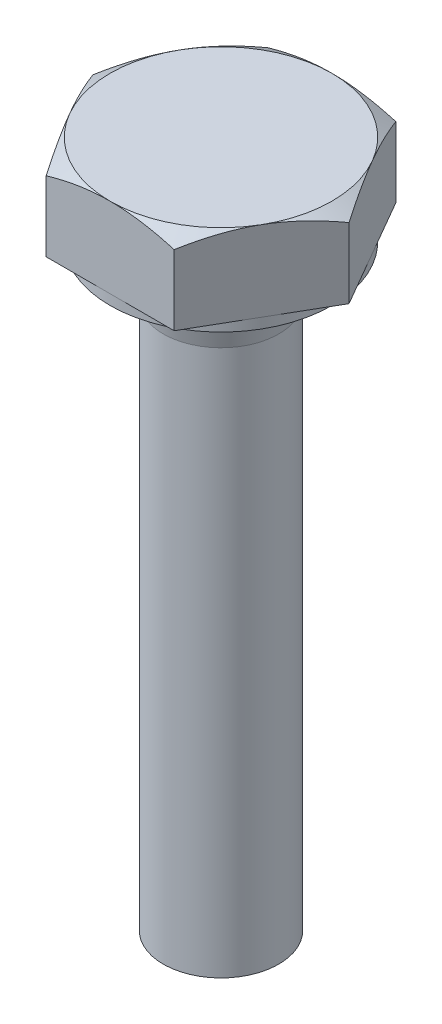
ISO-10303-21;
HEADER;
FILE_DESCRIPTION(('STEP AP214'),'2;1');
FILE_NAME('part.step','',(''),(''),'','','');
FILE_SCHEMA(('AUTOMOTIVE_DESIGN { 1 0 10303 214 1 1 1 1 }'));
ENDSEC;
DATA;
#1=APPLICATION_CONTEXT('core data for automotive mechanical design processes');
#2=APPLICATION_PROTOCOL_DEFINITION('international standard','automotive_design',2000,#1);
#3=PRODUCT_CONTEXT('',#1,'mechanical');
#4=PRODUCT('Part','Part','',(#3));
#5=PRODUCT_RELATED_PRODUCT_CATEGORY('part','',(#4));
#6=PRODUCT_DEFINITION_FORMATION('','',#4);
#7=PRODUCT_DEFINITION_CONTEXT('part definition',#1,'design');
#8=PRODUCT_DEFINITION('design','',#6,#7);
#9=PRODUCT_DEFINITION_SHAPE('','',#8);
#10=(LENGTH_UNIT() NAMED_UNIT(*) SI_UNIT(.MILLI.,.METRE.));
#11=(NAMED_UNIT(*) PLANE_ANGLE_UNIT() SI_UNIT($,.RADIAN.));
#12=(NAMED_UNIT(*) SI_UNIT($,.STERADIAN.) SOLID_ANGLE_UNIT());
#13=UNCERTAINTY_MEASURE_WITH_UNIT(LENGTH_MEASURE(1.E-05),#10,'distance_accuracy_value','');
#14=(GEOMETRIC_REPRESENTATION_CONTEXT(3) GLOBAL_UNCERTAINTY_ASSIGNED_CONTEXT((#13)) GLOBAL_UNIT_ASSIGNED_CONTEXT((#10,
#11,#12)) REPRESENTATION_CONTEXT('',''));
#15=CARTESIAN_POINT('',(0.,0.,0.));
#16=DIRECTION('',(0.,0.,1.));
#17=DIRECTION('',(1.,0.,0.));
#18=AXIS2_PLACEMENT_3D('',#15,#16,#17);
#19=CARTESIAN_POINT('',(7.5055,0.6,0.));
#20=DIRECTION('',(0.,1.,0.));
#21=DIRECTION('',(-1.,0.,0.));
#22=AXIS2_PLACEMENT_3D('',#19,#20,#21);
#23=PLANE('',#22);
#24=DIRECTION('',(-1.,0.,0.));
#25=VECTOR('',#24,1.);
#26=CARTESIAN_POINT('',(7.5055,0.6,-6.5));
#27=LINE('',#26,#25);
#28=CARTESIAN_POINT('',(3.75266974965824,0.599999999999997,-6.5));
#29=VERTEX_POINT('',#28);
#30=CARTESIAN_POINT('',(0.,0.599999999999999,-6.5));
#31=VERTEX_POINT('',#30);
#32=EDGE_CURVE('E315',#29,#31,#27,.T.);
#33=ORIENTED_EDGE('',*,*,#32,.F.);
#34=CARTESIAN_POINT('',(0.,0.599999999999999,0.));
#35=DIRECTION('',(0.,1.,0.));
#36=DIRECTION('',(-1.,0.,0.));
#37=AXIS2_PLACEMENT_3D('',#34,#35,#36);
#38=CIRCLE('',#37,7.5055);
#39=CARTESIAN_POINT('',(3.75283024976971,0.599999999999997,-6.49990733521743));
#40=VERTEX_POINT('',#39);
#41=EDGE_CURVE('E343',#40,#29,#38,.T.);
#42=ORIENTED_EDGE('',*,*,#41,.F.);
#43=DIRECTION('',(-0.499999999999999,0.,-0.866025403784439));
#44=VECTOR('',#43,1.);
#45=CARTESIAN_POINT('',(7.50554012459883,0.6,-2.31659479366357E-05));
#46=LINE('',#45,#44);
#47=CARTESIAN_POINT('',(5.62916512459884,0.6,-3.24999999999998));
#48=VERTEX_POINT('',#47);
#49=EDGE_CURVE('E309',#48,#40,#46,.T.);
#50=ORIENTED_EDGE('',*,*,#49,.F.);
#51=CARTESIAN_POINT('',(0.,0.599999999999999,0.));
#52=DIRECTION('',(0.,1.,0.));
#53=DIRECTION('',(-1.,0.,0.));
#54=AXIS2_PLACEMENT_3D('',#51,#52,#53);
#55=CIRCLE('',#54,6.5);
#56=EDGE_CURVE('E365',#48,#31,#55,.T.);
#57=ORIENTED_EDGE('',*,*,#56,.T.);
#58=EDGE_LOOP('',(#33,#42,#50,#57));
#59=FACE_BOUND('',#58,.T.);
#60=ADVANCED_FACE('F34',(#59),#23,.F.);
#61=CARTESIAN_POINT('',(-3.75266974965824,0.599999999999997,-6.5));
#62=VERTEX_POINT('',#61);
#63=EDGE_CURVE('E314',#31,#62,#27,.T.);
#64=ORIENTED_EDGE('',*,*,#63,.F.);
#65=CARTESIAN_POINT('',(-5.62916512459884,0.599999999999998,-3.24999999999999));
#66=VERTEX_POINT('',#65);
#67=EDGE_CURVE('E363',#31,#66,#55,.T.);
#68=ORIENTED_EDGE('',*,*,#67,.T.);
#69=DIRECTION('',(-0.499999999999999,0.,0.866025403784439));
#70=VECTOR('',#69,1.);
#71=CARTESIAN_POINT('',(-3.75279012459885,0.599999999999999,-6.49997683405203));
#72=LINE('',#71,#70);
#73=CARTESIAN_POINT('',(-3.75283024976972,0.599999999999997,-6.49990733521743));
#74=VERTEX_POINT('',#73);
#75=EDGE_CURVE('E269',#74,#66,#72,.T.);
#76=ORIENTED_EDGE('',*,*,#75,.F.);
#77=EDGE_CURVE('E173',#62,#74,#38,.T.);
#78=ORIENTED_EDGE('',*,*,#77,.F.);
#79=EDGE_LOOP('',(#64,#68,#76,#78));
#80=FACE_BOUND('',#79,.T.);
#81=ADVANCED_FACE('F227',(#80),#23,.F.);
#82=CARTESIAN_POINT('',(7.50549999942797,0.599999999999997,-9.26647825364585E-05));
#83=VERTEX_POINT('',#82);
#84=EDGE_CURVE('E308',#83,#48,#46,.T.);
#85=ORIENTED_EDGE('',*,*,#84,.F.);
#86=CARTESIAN_POINT('',(7.50549999942797,0.599999999999997,9.26647825347238E-05));
#87=VERTEX_POINT('',#86);
#88=EDGE_CURVE('E346',#87,#83,#38,.T.);
#89=ORIENTED_EDGE('',*,*,#88,.F.);
#90=DIRECTION('',(0.499999999999999,0.,-0.866025403784439));
#91=VECTOR('',#90,1.);
#92=CARTESIAN_POINT('',(7.50554012459883,0.6,2.3165947936202E-05));
#93=LINE('',#92,#91);
#94=CARTESIAN_POINT('',(5.62916512459884,0.6,3.24999999999998));
#95=VERTEX_POINT('',#94);
#96=EDGE_CURVE('E422',#95,#87,#93,.T.);
#97=ORIENTED_EDGE('',*,*,#96,.F.);
#98=EDGE_CURVE('E368',#95,#48,#55,.T.);
#99=ORIENTED_EDGE('',*,*,#98,.T.);
#100=EDGE_LOOP('',(#85,#89,#97,#99));
#101=FACE_BOUND('',#100,.T.);
#102=ADVANCED_FACE('F234',(#101),#23,.F.);
#103=CARTESIAN_POINT('',(3.75283024976971,0.599999999999997,6.49990733521743));
#104=VERTEX_POINT('',#103);
#105=EDGE_CURVE('E380',#104,#95,#93,.T.);
#106=ORIENTED_EDGE('',*,*,#105,.F.);
#107=CARTESIAN_POINT('',(3.75266974965824,0.599999999999997,6.5));
#108=VERTEX_POINT('',#107);
#109=EDGE_CURVE('E348',#108,#104,#38,.T.);
#110=ORIENTED_EDGE('',*,*,#109,.F.);
#111=DIRECTION('',(1.,0.,0.));
#112=VECTOR('',#111,1.);
#113=CARTESIAN_POINT('',(7.5055,0.6,6.5));
#114=LINE('',#113,#112);
#115=CARTESIAN_POINT('',(0.,0.599999999999999,6.5));
#116=VERTEX_POINT('',#115);
#117=EDGE_CURVE('E381',#116,#108,#114,.T.);
#118=ORIENTED_EDGE('',*,*,#117,.F.);
#119=EDGE_CURVE('E196',#116,#95,#55,.T.);
#120=ORIENTED_EDGE('',*,*,#119,.T.);
#121=EDGE_LOOP('',(#106,#110,#118,#120));
#122=FACE_BOUND('',#121,.T.);
#123=ADVANCED_FACE('F248',(#122),#23,.F.);
#124=CARTESIAN_POINT('',(-3.75266974965824,0.599999999999997,6.5));
#125=VERTEX_POINT('',#124);
#126=EDGE_CURVE('E386',#125,#116,#114,.T.);
#127=ORIENTED_EDGE('',*,*,#126,.F.);
#128=CARTESIAN_POINT('',(-3.75283024976973,0.599999999999997,6.49990733521742));
#129=VERTEX_POINT('',#128);
#130=EDGE_CURVE('E191',#129,#125,#38,.T.);
#131=ORIENTED_EDGE('',*,*,#130,.F.);
#132=DIRECTION('',(0.499999999999998,0.,0.86602540378444));
#133=VECTOR('',#132,1.);
#134=CARTESIAN_POINT('',(-3.75279012459886,0.599999999999999,6.49997683405203));
#135=LINE('',#134,#133);
#136=CARTESIAN_POINT('',(-5.62916512459885,0.599999999999998,3.24999999999998));
#137=VERTEX_POINT('',#136);
#138=EDGE_CURVE('E260',#137,#129,#135,.T.);
#139=ORIENTED_EDGE('',*,*,#138,.F.);
#140=EDGE_CURVE('E192',#137,#116,#55,.T.);
#141=ORIENTED_EDGE('',*,*,#140,.T.);
#142=EDGE_LOOP('',(#127,#131,#139,#141));
#143=FACE_BOUND('',#142,.T.);
#144=ADVANCED_FACE('F240',(#143),#23,.F.);
#145=CARTESIAN_POINT('',(-7.50549999942797,0.599999999999997,9.26647825403616E-05));
#146=VERTEX_POINT('',#145);
#147=EDGE_CURVE('E253',#146,#137,#135,.T.);
#148=ORIENTED_EDGE('',*,*,#147,.F.);
#149=CARTESIAN_POINT('',(-7.50549999942797,0.599999999999997,-9.26647825420963E-05));
#150=VERTEX_POINT('',#149);
#151=EDGE_CURVE('E188',#150,#146,#38,.T.);
#152=ORIENTED_EDGE('',*,*,#151,.F.);
#153=EDGE_CURVE('E267',#66,#150,#72,.T.);
#154=ORIENTED_EDGE('',*,*,#153,.F.);
#155=EDGE_CURVE('E197',#66,#137,#55,.T.);
#156=ORIENTED_EDGE('',*,*,#155,.T.);
#157=EDGE_LOOP('',(#148,#152,#154,#156));
#158=FACE_BOUND('',#157,.T.);
#159=ADVANCED_FACE('F230',(#158),#23,.F.);
#160=CARTESIAN_POINT('',(0.,5.3,0.));
#161=DIRECTION('',(0.,1.,0.));
#162=DIRECTION('',(-1.,0.,0.));
#163=AXIS2_PLACEMENT_3D('',#160,#161,#162);
#164=CYLINDRICAL_SURFACE('',#163,7.5055);
#165=DIRECTION('',(0.,1.,0.));
#166=VECTOR('',#165,1.);
#167=CARTESIAN_POINT('',(-3.75266974965824,5.3,-6.5));
#168=LINE('',#167,#166);
#169=CARTESIAN_POINT('',(-3.75266974965824,4.71947430432983,-6.5));
#170=VERTEX_POINT('',#169);
#171=EDGE_CURVE('E313',#62,#170,#168,.T.);
#172=ORIENTED_EDGE('',*,*,#171,.F.);
#173=ORIENTED_EDGE('',*,*,#77,.T.);
#174=DIRECTION('',(0.,1.,0.));
#175=VECTOR('',#174,1.);
#176=CARTESIAN_POINT('',(-3.75283024976972,5.3,-6.49990733521743));
#177=LINE('',#176,#175);
#178=CARTESIAN_POINT('',(-3.75283024976972,4.71947430432983,-6.49990733521743));
#179=VERTEX_POINT('',#178);
#180=EDGE_CURVE('E159',#179,#74,#177,.F.);
#181=ORIENTED_EDGE('',*,*,#180,.F.);
#182=CARTESIAN_POINT('',(0.,4.71947430432983,0.));
#183=DIRECTION('',(0.,1.,0.));
#184=DIRECTION('',(-1.,0.,0.));
#185=AXIS2_PLACEMENT_3D('',#182,#183,#184);
#186=CIRCLE('',#185,7.5055);
#187=EDGE_CURVE('E171',#170,#179,#186,.T.);
#188=ORIENTED_EDGE('',*,*,#187,.F.);
#189=EDGE_LOOP('',(#172,#173,#181,#188));
#190=FACE_BOUND('',#189,.T.);
#191=ADVANCED_FACE('F170',(#190),#164,.T.);
#192=DIRECTION('',(0.,1.,0.));
#193=VECTOR('',#192,1.);
#194=CARTESIAN_POINT('',(3.75266974965823,5.3,-6.5));
#195=LINE('',#194,#193);
#196=CARTESIAN_POINT('',(3.75266974965823,4.71947430432983,-6.5));
#197=VERTEX_POINT('',#196);
#198=EDGE_CURVE('E311',#197,#29,#195,.F.);
#199=ORIENTED_EDGE('',*,*,#198,.F.);
#200=CARTESIAN_POINT('',(3.75283024976971,4.71947430432983,-6.49990733521743));
#201=VERTEX_POINT('',#200);
#202=EDGE_CURVE('E177',#201,#197,#186,.T.);
#203=ORIENTED_EDGE('',*,*,#202,.F.);
#204=DIRECTION('',(0.,1.,0.));
#205=VECTOR('',#204,1.);
#206=CARTESIAN_POINT('',(3.75283024976971,5.3,-6.49990733521743));
#207=LINE('',#206,#205);
#208=EDGE_CURVE('E344',#40,#201,#207,.T.);
#209=ORIENTED_EDGE('',*,*,#208,.F.);
#210=ORIENTED_EDGE('',*,*,#41,.T.);
#211=EDGE_LOOP('',(#199,#203,#209,#210));
#212=FACE_BOUND('',#211,.T.);
#213=ADVANCED_FACE('F246',(#212),#164,.T.);
#214=DIRECTION('',(0.,1.,0.));
#215=VECTOR('',#214,1.);
#216=CARTESIAN_POINT('',(7.50549999942797,5.3,-9.26647825364585E-05));
#217=LINE('',#216,#215);
#218=CARTESIAN_POINT('',(7.50549999942797,4.71947430432983,-9.26647825360234E-05));
#219=VERTEX_POINT('',#218);
#220=EDGE_CURVE('E423',#219,#83,#217,.F.);
#221=ORIENTED_EDGE('',*,*,#220,.F.);
#222=CARTESIAN_POINT('',(7.50549999942797,4.71947430432983,9.26647825344351E-05));
#223=VERTEX_POINT('',#222);
#224=EDGE_CURVE('E181',#223,#219,#186,.T.);
#225=ORIENTED_EDGE('',*,*,#224,.F.);
#226=DIRECTION('',(0.,1.,0.));
#227=VECTOR('',#226,1.);
#228=CARTESIAN_POINT('',(7.50549999942797,5.3,9.26647825347238E-05));
#229=LINE('',#228,#227);
#230=EDGE_CURVE('E424',#87,#223,#229,.T.);
#231=ORIENTED_EDGE('',*,*,#230,.F.);
#232=ORIENTED_EDGE('',*,*,#88,.T.);
#233=EDGE_LOOP('',(#221,#225,#231,#232));
#234=FACE_BOUND('',#233,.T.);
#235=ADVANCED_FACE('F438',(#234),#164,.T.);
#236=DIRECTION('',(0.,1.,0.));
#237=VECTOR('',#236,1.);
#238=CARTESIAN_POINT('',(3.75283024976971,5.3,6.49990733521743));
#239=LINE('',#238,#237);
#240=CARTESIAN_POINT('',(3.75283024976971,4.71947430432983,6.49990733521743));
#241=VERTEX_POINT('',#240);
#242=EDGE_CURVE('E405',#241,#104,#239,.F.);
#243=ORIENTED_EDGE('',*,*,#242,.F.);
#244=CARTESIAN_POINT('',(3.75266974965824,4.71947430432983,6.5));
#245=VERTEX_POINT('',#244);
#246=EDGE_CURVE('E435',#245,#241,#186,.T.);
#247=ORIENTED_EDGE('',*,*,#246,.F.);
#248=DIRECTION('',(0.,1.,0.));
#249=VECTOR('',#248,1.);
#250=CARTESIAN_POINT('',(3.75266974965824,5.3,6.5));
#251=LINE('',#250,#249);
#252=EDGE_CURVE('E396',#108,#245,#251,.T.);
#253=ORIENTED_EDGE('',*,*,#252,.F.);
#254=ORIENTED_EDGE('',*,*,#109,.T.);
#255=EDGE_LOOP('',(#243,#247,#253,#254));
#256=FACE_BOUND('',#255,.T.);
#257=ADVANCED_FACE('F446',(#256),#164,.T.);
#258=DIRECTION('',(0.,1.,0.));
#259=VECTOR('',#258,1.);
#260=CARTESIAN_POINT('',(-3.75266974965824,5.3,6.5));
#261=LINE('',#260,#259);
#262=CARTESIAN_POINT('',(-3.75266974965824,4.71947430432983,6.5));
#263=VERTEX_POINT('',#262);
#264=EDGE_CURVE('E394',#263,#125,#261,.F.);
#265=ORIENTED_EDGE('',*,*,#264,.F.);
#266=CARTESIAN_POINT('',(-3.75283024976973,4.71947430432983,6.49990733521742));
#267=VERTEX_POINT('',#266);
#268=EDGE_CURVE('E184',#267,#263,#186,.T.);
#269=ORIENTED_EDGE('',*,*,#268,.F.);
#270=DIRECTION('',(0.,1.,0.));
#271=VECTOR('',#270,1.);
#272=CARTESIAN_POINT('',(-3.75283024976973,5.3,6.49990733521742));
#273=LINE('',#272,#271);
#274=EDGE_CURVE('E387',#129,#267,#273,.T.);
#275=ORIENTED_EDGE('',*,*,#274,.F.);
#276=ORIENTED_EDGE('',*,*,#130,.T.);
#277=EDGE_LOOP('',(#265,#269,#275,#276));
#278=FACE_BOUND('',#277,.T.);
#279=ADVANCED_FACE('F444',(#278),#164,.T.);
#280=DIRECTION('',(0.,1.,0.));
#281=VECTOR('',#280,1.);
#282=CARTESIAN_POINT('',(-7.50549999942797,5.3,9.26647825403616E-05));
#283=LINE('',#282,#281);
#284=CARTESIAN_POINT('',(-7.50549999942797,4.71947430432983,9.26647825423567E-05));
#285=VERTEX_POINT('',#284);
#286=EDGE_CURVE('E266',#285,#146,#283,.F.);
#287=ORIENTED_EDGE('',*,*,#286,.F.);
#288=CARTESIAN_POINT('',(-7.50549999942797,4.71947430432983,-9.26647825414886E-05));
#289=VERTEX_POINT('',#288);
#290=EDGE_CURVE('E178',#289,#285,#186,.T.);
#291=ORIENTED_EDGE('',*,*,#290,.F.);
#292=DIRECTION('',(0.,1.,0.));
#293=VECTOR('',#292,1.);
#294=CARTESIAN_POINT('',(-7.50549999942797,5.3,-9.26647825420963E-05));
#295=LINE('',#294,#293);
#296=EDGE_CURVE('E174',#150,#289,#295,.T.);
#297=ORIENTED_EDGE('',*,*,#296,.F.);
#298=ORIENTED_EDGE('',*,*,#151,.T.);
#299=EDGE_LOOP('',(#287,#291,#297,#298));
#300=FACE_BOUND('',#299,.T.);
#301=ADVANCED_FACE('F247',(#300),#164,.T.);
#302=CARTESIAN_POINT('',(0.,4.71947430432983,0.));
#303=DIRECTION('',(0.,-1.,0.));
#304=DIRECTION('',(1.,0.,0.));
#305=AXIS2_PLACEMENT_3D('',#302,#303,#304);
#306=CONICAL_SURFACE('',#305,7.5055,1.0471975511966);
#307=CARTESIAN_POINT('',(-9.95291269947967,2.18957848644785,-6.5));
#308=CARTESIAN_POINT('',(-9.6675259773592,2.32749309742783,-6.5));
#309=CARTESIAN_POINT('',(-9.38146450432172,2.46403672116243,-6.5));
#310=CARTESIAN_POINT('',(-8.80762722394583,2.7335985660454,-6.5));
#311=CARTESIAN_POINT('',(-8.51985113021541,2.86661617680852,-6.5));
#312=CARTESIAN_POINT('',(-7.94066523066117,3.12904331265471,-6.5));
#313=CARTESIAN_POINT('',(-7.64924405469006,3.25842783400536,-6.5));
#314=CARTESIAN_POINT('',(-7.06400645896564,3.51163948742872,-6.5));
#315=CARTESIAN_POINT('',(-6.77019016501115,3.63546690918299,-6.5));
#316=CARTESIAN_POINT('',(-6.17604762701244,3.87755673999455,-6.5));
#317=CARTESIAN_POINT('',(-5.87568574557132,3.99573216501375,-6.5));
#318=CARTESIAN_POINT('',(-5.27141895767035,4.22282746608413,-6.5));
#319=CARTESIAN_POINT('',(-4.96751366128924,4.33174631238885,-6.5));
#320=CARTESIAN_POINT('',(-4.35630181726158,4.53740213616556,-6.5));
#321=CARTESIAN_POINT('',(-4.04900407206332,4.63416501226556,-6.5));
#322=CARTESIAN_POINT('',(-3.43003676090722,4.81236522173217,-6.5));
#323=CARTESIAN_POINT('',(-3.11836861110241,4.89380740158612,-6.5));
#324=CARTESIAN_POINT('',(-2.49046262633262,5.0374166069193,-6.5));
#325=CARTESIAN_POINT('',(-2.17422359799008,5.09957849991129,-6.5));
#326=CARTESIAN_POINT('',(-1.53788849691383,5.20042620033131,-6.5));
#327=CARTESIAN_POINT('',(-1.21779242076947,5.23911198699878,-6.5));
#328=CARTESIAN_POINT('',(-0.737138914817065,5.27705363612799,-6.5));
#329=CARTESIAN_POINT('',(-0.577333864138186,5.28635493938451,-6.5));
#330=CARTESIAN_POINT('',(-0.257465936730629,5.29818597961714,-6.5));
#331=CARTESIAN_POINT('',(-0.097403063377139,5.30071580453011,-6.5));
#332=CARTESIAN_POINT('',(0.222638328627014,5.29893593089712,-6.5));
#333=CARTESIAN_POINT('',(0.382616858344424,5.29462815183897,-6.5));
#334=CARTESIAN_POINT('',(0.702253433016711,5.27928224340891,-6.5));
#335=CARTESIAN_POINT('',(0.861911461567568,5.26824377793354,-6.5));
#336=CARTESIAN_POINT('',(1.24887336524002,5.23356282461755,-6.5));
#337=CARTESIAN_POINT('',(1.47587987136213,5.20654774859047,-6.5));
#338=CARTESIAN_POINT('',(1.92815341231724,5.1404096028995,-6.5));
#339=CARTESIAN_POINT('',(2.15341995514115,5.1012832283723,-6.5));
#340=CARTESIAN_POINT('',(2.6020276496592,5.01231010679479,-6.5));
#341=CARTESIAN_POINT('',(2.82536677176941,4.96245322355412,-6.5));
#342=CARTESIAN_POINT('',(3.26974717680381,4.8535402946474,-6.5));
#343=CARTESIAN_POINT('',(3.4907886741052,4.79448511558719,-6.5));
#344=CARTESIAN_POINT('',(3.93601802117897,4.66704472446996,-6.5));
#345=CARTESIAN_POINT('',(4.16015018317409,4.59846629640647,-6.5));
#346=CARTESIAN_POINT('',(4.60604542478353,4.45453350457655,-6.5));
#347=CARTESIAN_POINT('',(4.82781002203382,4.37918381444797,-6.5));
#348=CARTESIAN_POINT('',(5.26808027322029,4.2232649191793,-6.5));
#349=CARTESIAN_POINT('',(5.48659724474679,4.14272748021712,-6.5));
#350=CARTESIAN_POINT('',(5.92193579991885,3.97692551915033,-6.5));
#351=CARTESIAN_POINT('',(6.13875665736554,3.89165908651638,-6.5));
#352=CARTESIAN_POINT('',(6.35478982902261,3.8044959591292,-6.5));
#353=B_SPLINE_CURVE_WITH_KNOTS('',3,(#307,#308,#309,#310,#311,#312,#313,#314,#315,#316,#317,
#318,#319,#320,#321,#322,#323,#324,#325,#326,#327,#328,#329,#330,#331,#332,#333,#334,#335,#336,
#337,#338,#339,#340,#341,#342,#343,#344,#345,#346,#347,#348,#349,#350,#351,#352),.UNSPECIFIED.,
.F.,.F.,(4,2,2,2,2,2,2,2,2,2,2,2,2,2,2,2,2,2,2,2,2,2,4),(0.,0.950904028508474,1.90197160625741,
2.85848176713614,3.81494200881637,4.78314454868004,5.75145465546106,6.71766544283005,
7.68357006709837,8.64973159867958,9.61589398466221,10.0959986257968,10.5760970320903,
11.0560606864915,11.5360483103126,12.2214914630235,12.9071218207522,13.593402699626,
14.279618960479,14.9826558440908,15.6852111532502,16.3838120072837,17.082697183989),.UNSPECIFIED.);
#354=CARTESIAN_POINT('',(0.,5.3,-6.5));
#355=VERTEX_POINT('',#354);
#356=EDGE_CURVE('E57',#170,#355,#353,.T.);
#357=ORIENTED_EDGE('',*,*,#356,.F.);
#358=ORIENTED_EDGE('',*,*,#187,.T.);
#359=CARTESIAN_POINT('',(-7.50566896951895,4.71937674819414,0.000200000000001255));
#360=CARTESIAN_POINT('',(-7.42317863007018,4.76699557692452,-0.142677459058879));
#361=CARTESIAN_POINT('',(-7.34038072665456,4.8124532993973,-0.286087634534911));
#362=CARTESIAN_POINT('',(-7.17411251123974,4.89845131797696,-0.574072631317193));
#363=CARTESIAN_POINT('',(-7.09064192560663,4.93898949277198,-0.718647926571262));
#364=CARTESIAN_POINT('',(-6.83889369625717,5.0524289988768,-1.15468865052003));
#365=CARTESIAN_POINT('',(-6.66962231516079,5.11695219287127,-1.44787528284632));
#366=CARTESIAN_POINT('',(-6.41631077211553,5.19261341645252,-1.88662374554437));
#367=CARTESIAN_POINT('',(-6.33302748139453,5.21416714354302,-2.03087463649469));
#368=CARTESIAN_POINT('',(-6.16608458377292,5.25030968539389,-2.32002821713808));
#369=CARTESIAN_POINT('',(-6.08242501078141,5.26489911554034,-2.46493084809888));
#370=CARTESIAN_POINT('',(-5.91496056339805,5.28674124749266,-2.75498777942831));
#371=CARTESIAN_POINT('',(-5.83115596252169,5.2940022756779,-2.9001416060542));
#372=CARTESIAN_POINT('',(-5.66347396979285,5.30103969741777,-3.19057533697494));
#373=CARTESIAN_POINT('',(-5.57959658026909,5.3008163221878,-3.33585523723635));
#374=CARTESIAN_POINT('',(-5.34979921898452,5.28991654148484,-3.73387594242649));
#375=CARTESIAN_POINT('',(-5.20395446807006,5.27161818213059,-3.98648646102756));
#376=CARTESIAN_POINT('',(-4.91323365606635,5.21359365854233,-4.49002967823567));
#377=CARTESIAN_POINT('',(-4.76835861741225,5.17384766146176,-4.74096060593308));
#378=CARTESIAN_POINT('',(-4.47705272008731,5.07449409679785,-5.24551722064432));
#379=CARTESIAN_POINT('',(-4.33065861912702,5.01446557436198,-5.49907924143591));
#380=CARTESIAN_POINT('',(-4.04005357906493,4.87822500749013,-6.00242193575904));
#381=CARTESIAN_POINT('',(-3.89583891821181,4.80204496583641,-6.25220905555296));
#382=CARTESIAN_POINT('',(-3.75266127967872,4.71937674819413,-6.5002));
#383=B_SPLINE_CURVE_WITH_KNOTS('',3,(#359,#360,#361,#362,#363,#364,#365,#366,#367,#368,#369,
#370,#371,#372,#373,#374,#375,#376,#377,#378,#379,#380,#381,#382),.UNSPECIFIED.,.F.,.F.,(4,2,2,
2,2,2,2,2,2,2,2,4),(0.,0.515105052395586,1.03043143507524,2.06322554824262,2.56697389547996,
3.07067772176453,3.57380860368927,4.07692394242519,4.95279354705659,5.82947446853465,
6.72559912449736,7.61996451221045),.UNSPECIFIED.);
#384=CARTESIAN_POINT('',(-5.62916512459884,5.3,-3.24999999999999));
#385=VERTEX_POINT('',#384);
#386=EDGE_CURVE('E156',#385,#179,#383,.T.);
#387=ORIENTED_EDGE('',*,*,#386,.F.);
#388=CARTESIAN_POINT('',(0.,5.3,0.));
#389=DIRECTION('',(0.,1.,0.));
#390=DIRECTION('',(-1.,0.,0.));
#391=AXIS2_PLACEMENT_3D('',#388,#389,#390);
#392=CIRCLE('',#391,6.5);
#393=EDGE_CURVE('E319',#355,#385,#392,.T.);
#394=ORIENTED_EDGE('',*,*,#393,.F.);
#395=EDGE_LOOP('',(#357,#358,#387,#394));
#396=FACE_BOUND('',#395,.T.);
#397=ADVANCED_FACE('F176',(#396),#306,.T.);
#398=EDGE_CURVE('E302',#355,#197,#353,.T.);
#399=ORIENTED_EDGE('',*,*,#398,.F.);
#400=CARTESIAN_POINT('',(5.62916512459884,5.3,-3.24999999999999));
#401=VERTEX_POINT('',#400);
#402=EDGE_CURVE('E324',#401,#355,#392,.T.);
#403=ORIENTED_EDGE('',*,*,#402,.F.);
#404=CARTESIAN_POINT('',(3.75266127967872,4.71937674819413,-6.5002));
#405=CARTESIAN_POINT('',(3.83515161912749,4.76699557692452,-6.35732254094112));
#406=CARTESIAN_POINT('',(3.91794952254311,4.8124532993973,-6.21391236546509));
#407=CARTESIAN_POINT('',(4.08421773795793,4.89845131797696,-5.9259273686828));
#408=CARTESIAN_POINT('',(4.16768832359104,4.93898949277198,-5.78135207342874));
#409=CARTESIAN_POINT('',(4.4194365529405,5.0524289988768,-5.34531134947997));
#410=CARTESIAN_POINT('',(4.58870793403688,5.11695219287127,-5.05212471715368));
#411=CARTESIAN_POINT('',(4.84201947708213,5.19261341645251,-4.61337625445563));
#412=CARTESIAN_POINT('',(4.92530276780314,5.21416714354302,-4.46912536350531));
#413=CARTESIAN_POINT('',(5.09224566542475,5.25030968539389,-4.17997178286191));
#414=CARTESIAN_POINT('',(5.17590523841625,5.26489911554034,-4.03506915190111));
#415=CARTESIAN_POINT('',(5.34336968579962,5.28674124749266,-3.74501222057168));
#416=CARTESIAN_POINT('',(5.42717428667598,5.2940022756779,-3.59985839394579));
#417=CARTESIAN_POINT('',(5.59485627940482,5.30103969741778,-3.30942466302505));
#418=CARTESIAN_POINT('',(5.67873366892858,5.3008163221878,-3.16414476276364));
#419=CARTESIAN_POINT('',(5.90853103021315,5.28991654148485,-2.76612405757351));
#420=CARTESIAN_POINT('',(6.05437578112761,5.2716181821306,-2.51351353897243));
#421=CARTESIAN_POINT('',(6.34509659313132,5.21359365854234,-2.00997032176432));
#422=CARTESIAN_POINT('',(6.48997163178542,5.17384766146177,-1.75903939406692));
#423=CARTESIAN_POINT('',(6.78127752911036,5.07449409679786,-1.25448277935568));
#424=CARTESIAN_POINT('',(6.92767163007065,5.01446557436199,-1.00092075856409));
#425=CARTESIAN_POINT('',(7.21827667013274,4.87822500749015,-0.497578064240956));
#426=CARTESIAN_POINT('',(7.36249133098586,4.80204496583642,-0.247790944447038));
#427=CARTESIAN_POINT('',(7.50566896951895,4.71937674819415,0.000199999999999551));
#428=B_SPLINE_CURVE_WITH_KNOTS('',3,(#404,#405,#406,#407,#408,#409,#410,#411,#412,#413,#414,
#415,#416,#417,#418,#419,#420,#421,#422,#423,#424,#425,#426,#427),.UNSPECIFIED.,.F.,.F.,(4,2,2,
2,2,2,2,2,2,2,2,4),(0.,0.515105052395587,1.03043143507524,2.06322554824262,2.56697389547996,
3.07067772176453,3.57380860368927,4.0769239424252,4.9527935470566,5.82947446853466,
6.72559912449736,7.61996451221045),.UNSPECIFIED.);
#429=EDGE_CURVE('E336',#201,#401,#428,.T.);
#430=ORIENTED_EDGE('',*,*,#429,.F.);
#431=ORIENTED_EDGE('',*,*,#202,.T.);
#432=EDGE_LOOP('',(#399,#403,#430,#431));
#433=FACE_BOUND('',#432,.T.);
#434=ADVANCED_FACE('F335',(#433),#306,.T.);
#435=EDGE_CURVE('E416',#401,#219,#428,.T.);
#436=ORIENTED_EDGE('',*,*,#435,.F.);
#437=CARTESIAN_POINT('',(5.62916512459884,5.3,3.24999999999998));
#438=VERTEX_POINT('',#437);
#439=EDGE_CURVE('E327',#438,#401,#392,.T.);
#440=ORIENTED_EDGE('',*,*,#439,.F.);
#441=CARTESIAN_POINT('',(7.50566896951895,4.71937674819415,-0.000200000000000583));
#442=CARTESIAN_POINT('',(7.42317863007017,4.76699557692453,0.142677459058879));
#443=CARTESIAN_POINT('',(7.34038072665455,4.81245329939731,0.286087634534911));
#444=CARTESIAN_POINT('',(7.17411251123973,4.89845131797697,0.574072631317193));
#445=CARTESIAN_POINT('',(7.09064192560663,4.93898949277199,0.718647926571262));
#446=CARTESIAN_POINT('',(6.83889369625717,5.0524289988768,1.15468865052003));
#447=CARTESIAN_POINT('',(6.66962231516079,5.11695219287127,1.44787528284632));
#448=CARTESIAN_POINT('',(6.41631077211553,5.19261341645252,1.88662374554437));
#449=CARTESIAN_POINT('',(6.33302748139452,5.21416714354302,2.03087463649468));
#450=CARTESIAN_POINT('',(6.16608458377291,5.25030968539389,2.32002821713808));
#451=CARTESIAN_POINT('',(6.08242501078141,5.26489911554034,2.46493084809888));
#452=CARTESIAN_POINT('',(5.91496056339805,5.28674124749266,2.75498777942831));
#453=CARTESIAN_POINT('',(5.83115596252169,5.2940022756779,2.9001416060542));
#454=CARTESIAN_POINT('',(5.66347396979285,5.30103969741778,3.19057533697494));
#455=CARTESIAN_POINT('',(5.57959658026909,5.3008163221878,3.33585523723635));
#456=CARTESIAN_POINT('',(5.34979921898452,5.28991654148484,3.73387594242649));
#457=CARTESIAN_POINT('',(5.20395446807005,5.2716181821306,3.98648646102756));
#458=CARTESIAN_POINT('',(4.91323365606634,5.21359365854233,4.49002967823567));
#459=CARTESIAN_POINT('',(4.76835861741224,5.17384766146176,4.74096060593308));
#460=CARTESIAN_POINT('',(4.4770527200873,5.07449409679786,5.24551722064432));
#461=CARTESIAN_POINT('',(4.33065861912701,5.01446557436198,5.49907924143591));
#462=CARTESIAN_POINT('',(4.04005357906492,4.87822500749014,6.00242193575904));
#463=CARTESIAN_POINT('',(3.8958389182118,4.80204496583641,6.25220905555296));
#464=CARTESIAN_POINT('',(3.75266127967872,4.71937674819414,6.5002));
#465=B_SPLINE_CURVE_WITH_KNOTS('',3,(#441,#442,#443,#444,#445,#446,#447,#448,#449,#450,#451,
#452,#453,#454,#455,#456,#457,#458,#459,#460,#461,#462,#463,#464),.UNSPECIFIED.,.F.,.F.,(4,2,2,
2,2,2,2,2,2,2,2,4),(0.,0.515105052395587,1.03043143507524,2.06322554824262,2.56697389547995,
3.07067772176453,3.57380860368926,4.07692394242519,4.95279354705659,5.82947446853465,
6.72559912449735,7.61996451221045),.UNSPECIFIED.);
#466=EDGE_CURVE('E404',#223,#438,#465,.T.);
#467=ORIENTED_EDGE('',*,*,#466,.F.);
#468=ORIENTED_EDGE('',*,*,#224,.T.);
#469=EDGE_LOOP('',(#436,#440,#467,#468));
#470=FACE_BOUND('',#469,.T.);
#471=ADVANCED_FACE('F437',(#470),#306,.T.);
#472=EDGE_CURVE('E399',#438,#241,#465,.T.);
#473=ORIENTED_EDGE('',*,*,#472,.F.);
#474=CARTESIAN_POINT('',(0.,5.3,6.5));
#475=VERTEX_POINT('',#474);
#476=EDGE_CURVE('E325',#475,#438,#392,.T.);
#477=ORIENTED_EDGE('',*,*,#476,.F.);
#478=CARTESIAN_POINT('',(-9.95291269947968,2.18957848644784,6.5));
#479=CARTESIAN_POINT('',(-9.66752597735922,2.32749309742783,6.5));
#480=CARTESIAN_POINT('',(-9.38146450432173,2.46403672116242,6.5));
#481=CARTESIAN_POINT('',(-8.80762722394584,2.7335985660454,6.5));
#482=CARTESIAN_POINT('',(-8.51985113021542,2.86661617680851,6.5));
#483=CARTESIAN_POINT('',(-7.94066523066118,3.12904331265471,6.5));
#484=CARTESIAN_POINT('',(-7.64924405469007,3.25842783400536,6.5));
#485=CARTESIAN_POINT('',(-7.06400645896564,3.51163948742872,6.5));
#486=CARTESIAN_POINT('',(-6.77019016501116,3.63546690918299,6.5));
#487=CARTESIAN_POINT('',(-6.17604762701245,3.87755673999455,6.5));
#488=CARTESIAN_POINT('',(-5.87568574557132,3.99573216501375,6.5));
#489=CARTESIAN_POINT('',(-5.27141895767035,4.22282746608413,6.5));
#490=CARTESIAN_POINT('',(-4.96751366128924,4.33174631238884,6.5));
#491=CARTESIAN_POINT('',(-4.35630181726158,4.53740213616555,6.5));
#492=CARTESIAN_POINT('',(-4.04900407206332,4.63416501226556,6.5));
#493=CARTESIAN_POINT('',(-3.43003676090722,4.81236522173217,6.5));
#494=CARTESIAN_POINT('',(-3.11836861110242,4.89380740158612,6.5));
#495=CARTESIAN_POINT('',(-2.49046262633263,5.0374166069193,6.5));
#496=CARTESIAN_POINT('',(-2.17422359799009,5.09957849991129,6.5));
#497=CARTESIAN_POINT('',(-1.53788849691383,5.20042620033131,6.5));
#498=CARTESIAN_POINT('',(-1.21779242076948,5.23911198699878,6.5));
#499=CARTESIAN_POINT('',(-0.737138914817072,5.27705363612799,6.5));
#500=CARTESIAN_POINT('',(-0.577333864138193,5.28635493938451,6.5));
#501=CARTESIAN_POINT('',(-0.257465936730636,5.29818597961714,6.5));
#502=CARTESIAN_POINT('',(-0.0974030633771464,5.30071580453011,6.5));
#503=CARTESIAN_POINT('',(0.222638328627007,5.29893593089712,6.5));
#504=CARTESIAN_POINT('',(0.382616858344417,5.29462815183897,6.5));
#505=CARTESIAN_POINT('',(0.702253433016705,5.27928224340891,6.5));
#506=CARTESIAN_POINT('',(0.861911461567562,5.26824377793354,6.5));
#507=CARTESIAN_POINT('',(1.24887336524001,5.23356282461756,6.5));
#508=CARTESIAN_POINT('',(1.47587987136212,5.20654774859048,6.5));
#509=CARTESIAN_POINT('',(1.92815341231724,5.1404096028995,6.5));
#510=CARTESIAN_POINT('',(2.15341995514115,5.1012832283723,6.5));
#511=CARTESIAN_POINT('',(2.6020276496592,5.0123101067948,6.5));
#512=CARTESIAN_POINT('',(2.8253667717694,4.96245322355412,6.5));
#513=CARTESIAN_POINT('',(3.2697471768038,4.8535402946474,6.5));
#514=CARTESIAN_POINT('',(3.4907886741052,4.79448511558719,6.5));
#515=CARTESIAN_POINT('',(3.93601802117896,4.66704472446996,6.5));
#516=CARTESIAN_POINT('',(4.16015018317408,4.59846629640647,6.5));
#517=CARTESIAN_POINT('',(4.60604542478352,4.45453350457655,6.5));
#518=CARTESIAN_POINT('',(4.82781002203381,4.37918381444798,6.5));
#519=CARTESIAN_POINT('',(5.26808027322028,4.2232649191793,6.5));
#520=CARTESIAN_POINT('',(5.48659724474678,4.14272748021712,6.5));
#521=CARTESIAN_POINT('',(5.92193579991884,3.97692551915034,6.5));
#522=CARTESIAN_POINT('',(6.13875665736553,3.89165908651639,6.5));
#523=CARTESIAN_POINT('',(6.35478982902259,3.8044959591292,6.5));
#524=B_SPLINE_CURVE_WITH_KNOTS('',3,(#478,#479,#480,#481,#482,#483,#484,#485,#486,#487,#488,
#489,#490,#491,#492,#493,#494,#495,#496,#497,#498,#499,#500,#501,#502,#503,#504,#505,#506,#507,
#508,#509,#510,#511,#512,#513,#514,#515,#516,#517,#518,#519,#520,#521,#522,#523),.UNSPECIFIED.,
.F.,.F.,(4,2,2,2,2,2,2,2,2,2,2,2,2,2,2,2,2,2,2,2,2,2,4),(0.,0.950904028508477,1.90197160625742,
2.85848176713614,3.81494200881637,4.78314454868004,5.75145465546106,6.71766544283006,
7.68357006709838,8.64973159867958,9.61589398466222,10.0959986257968,10.5760970320903,
11.0560606864915,11.5360483103126,12.2214914630235,12.9071218207522,13.593402699626,
14.279618960479,14.9826558440908,15.6852111532502,16.3838120072837,17.082697183989),.UNSPECIFIED.);
#525=EDGE_CURVE('E393',#245,#475,#524,.F.);
#526=ORIENTED_EDGE('',*,*,#525,.F.);
#527=ORIENTED_EDGE('',*,*,#246,.T.);
#528=EDGE_LOOP('',(#473,#477,#526,#527));
#529=FACE_BOUND('',#528,.T.);
#530=ADVANCED_FACE('F432',(#529),#306,.T.);
#531=EDGE_CURVE('E259',#475,#263,#524,.F.);
#532=ORIENTED_EDGE('',*,*,#531,.F.);
#533=CARTESIAN_POINT('',(-5.62916512459885,5.3,3.24999999999998));
#534=VERTEX_POINT('',#533);
#535=EDGE_CURVE('E183',#534,#475,#392,.T.);
#536=ORIENTED_EDGE('',*,*,#535,.F.);
#537=CARTESIAN_POINT('',(-3.75266127967873,4.71937674819413,6.5002));
#538=CARTESIAN_POINT('',(-3.8351516191275,4.76699557692451,6.35732254094112));
#539=CARTESIAN_POINT('',(-3.91794952254312,4.81245329939729,6.21391236546509));
#540=CARTESIAN_POINT('',(-4.08421773795795,4.89845131797695,5.9259273686828));
#541=CARTESIAN_POINT('',(-4.16768832359105,4.93898949277197,5.78135207342873));
#542=CARTESIAN_POINT('',(-4.41943655294051,5.05242899887679,5.34531134947996));
#543=CARTESIAN_POINT('',(-4.58870793403689,5.11695219287126,5.05212471715368));
#544=CARTESIAN_POINT('',(-4.84201947708215,5.19261341645251,4.61337625445562));
#545=CARTESIAN_POINT('',(-4.92530276780315,5.21416714354301,4.46912536350531));
#546=CARTESIAN_POINT('',(-5.09224566542476,5.25030968539388,4.17997178286191));
#547=CARTESIAN_POINT('',(-5.17590523841627,5.26489911554033,4.03506915190111));
#548=CARTESIAN_POINT('',(-5.34336968579963,5.28674124749265,3.74501222057168));
#549=CARTESIAN_POINT('',(-5.42717428667599,5.2940022756779,3.59985839394579));
#550=CARTESIAN_POINT('',(-5.59485627940483,5.30103969741777,3.30942466302505));
#551=CARTESIAN_POINT('',(-5.67873366892859,5.3008163221878,3.16414476276364));
#552=CARTESIAN_POINT('',(-5.90853103021316,5.28991654148484,2.7661240575735));
#553=CARTESIAN_POINT('',(-6.05437578112762,5.27161818213059,2.51351353897243));
#554=CARTESIAN_POINT('',(-6.34509659313133,5.21359365854233,2.00997032176432));
#555=CARTESIAN_POINT('',(-6.48997163178543,5.17384766146176,1.75903939406692));
#556=CARTESIAN_POINT('',(-6.78127752911037,5.07449409679786,1.25448277935568));
#557=CARTESIAN_POINT('',(-6.92767163007066,5.01446557436198,1.00092075856409));
#558=CARTESIAN_POINT('',(-7.21827667013275,4.87822500749014,0.497578064240955));
#559=CARTESIAN_POINT('',(-7.36249133098586,4.80204496583642,0.247790944447037));
#560=CARTESIAN_POINT('',(-7.50566896951895,4.71937674819414,-0.000199999999997741));
#561=B_SPLINE_CURVE_WITH_KNOTS('',3,(#537,#538,#539,#540,#541,#542,#543,#544,#545,#546,#547,
#548,#549,#550,#551,#552,#553,#554,#555,#556,#557,#558,#559,#560),.UNSPECIFIED.,.F.,.F.,(4,2,2,
2,2,2,2,2,2,2,2,4),(0.,0.515105052395588,1.03043143507524,2.06322554824262,2.56697389547996,
3.07067772176454,3.57380860368928,4.0769239424252,4.9527935470566,5.82947446853466,
6.72559912449735,7.61996451221044),.UNSPECIFIED.);
#562=EDGE_CURVE('E278',#267,#534,#561,.T.);
#563=ORIENTED_EDGE('',*,*,#562,.F.);
#564=ORIENTED_EDGE('',*,*,#268,.T.);
#565=EDGE_LOOP('',(#532,#536,#563,#564));
#566=FACE_BOUND('',#565,.T.);
#567=ADVANCED_FACE('F223',(#566),#306,.T.);
#568=EDGE_CURVE('E272',#534,#285,#561,.T.);
#569=ORIENTED_EDGE('',*,*,#568,.F.);
#570=EDGE_CURVE('E317',#385,#534,#392,.T.);
#571=ORIENTED_EDGE('',*,*,#570,.F.);
#572=EDGE_CURVE('E49',#289,#385,#383,.T.);
#573=ORIENTED_EDGE('',*,*,#572,.F.);
#574=ORIENTED_EDGE('',*,*,#290,.T.);
#575=EDGE_LOOP('',(#569,#571,#573,#574));
#576=FACE_BOUND('',#575,.T.);
#577=ADVANCED_FACE('F219',(#576),#306,.T.);
#578=CARTESIAN_POINT('',(3.3865,-35.,0.));
#579=DIRECTION('',(0.,1.,0.));
#580=DIRECTION('',(-1.,0.,0.));
#581=AXIS2_PLACEMENT_3D('',#578,#579,#580);
#582=PLANE('',#581);
#583=CARTESIAN_POINT('',(0.,-35.,0.));
#584=DIRECTION('',(0.,1.,0.));
#585=DIRECTION('',(-1.,0.,0.));
#586=AXIS2_PLACEMENT_3D('',#583,#584,#585);
#587=CIRCLE('',#586,3.3865);
#588=CARTESIAN_POINT('',(-3.38649999999999,-35.,0.));
#589=VERTEX_POINT('',#588);
#590=EDGE_CURVE('E12',#589,#589,#587,.T.);
#591=ORIENTED_EDGE('',*,*,#590,.F.);
#592=EDGE_LOOP('',(#591));
#593=FACE_BOUND('',#592,.T.);
#594=ADVANCED_FACE('F36',(#593),#582,.F.);
#595=CARTESIAN_POINT('',(0.,5.3,0.));
#596=DIRECTION('',(0.,1.,0.));
#597=DIRECTION('',(-1.,0.,0.));
#598=AXIS2_PLACEMENT_3D('',#595,#596,#597);
#599=CYLINDRICAL_SURFACE('',#598,3.3865);
#600=CARTESIAN_POINT('',(0.,-3.,0.));
#601=DIRECTION('',(0.,1.,0.));
#602=DIRECTION('',(-1.,0.,0.));
#603=AXIS2_PLACEMENT_3D('',#600,#601,#602);
#604=CIRCLE('',#603,3.3865);
#605=CARTESIAN_POINT('',(-3.3865,-3.,0.));
#606=VERTEX_POINT('',#605);
#607=EDGE_CURVE('E42',#606,#606,#604,.T.);
#608=ORIENTED_EDGE('',*,*,#607,.F.);
#609=EDGE_LOOP('',(#608));
#610=FACE_BOUND('',#609,.T.);
#611=ORIENTED_EDGE('',*,*,#590,.T.);
#612=EDGE_LOOP('',(#611));
#613=FACE_BOUND('',#612,.T.);
#614=ADVANCED_FACE('F213',(#610,#613),#599,.T.);
#615=CARTESIAN_POINT('',(0.,-3.,0.));
#616=DIRECTION('',(0.,1.,0.));
#617=DIRECTION('',(-1.,0.,0.));
#618=AXIS2_PLACEMENT_3D('',#615,#616,#617);
#619=CONICAL_SURFACE('',#618,3.3865,0.201209277219044);
#620=CARTESIAN_POINT('',(0.,-0.00200000000000113,0.));
#621=DIRECTION('',(0.,1.,0.));
#622=DIRECTION('',(-1.,0.,0.));
#623=AXIS2_PLACEMENT_3D('',#620,#621,#622);
#624=CIRCLE('',#623,3.998);
#625=CARTESIAN_POINT('',(-3.998,-0.00200000000000164,0.));
#626=VERTEX_POINT('',#625);
#627=EDGE_CURVE('E206',#626,#626,#624,.T.);
#628=ORIENTED_EDGE('',*,*,#627,.F.);
#629=EDGE_LOOP('',(#628));
#630=FACE_BOUND('',#629,.T.);
#631=ORIENTED_EDGE('',*,*,#607,.T.);
#632=EDGE_LOOP('',(#631));
#633=FACE_BOUND('',#632,.T.);
#634=ADVANCED_FACE('F211',(#630,#633),#619,.T.);
#635=CARTESIAN_POINT('',(4.,-0.00200000000000049,0.));
#636=DIRECTION('',(0.,1.,0.));
#637=DIRECTION('',(-1.,0.,0.));
#638=AXIS2_PLACEMENT_3D('',#635,#636,#637);
#639=PLANE('',#638);
#640=CARTESIAN_POINT('',(0.,-0.00200000000000113,0.));
#641=DIRECTION('',(0.,1.,0.));
#642=DIRECTION('',(-1.,0.,0.));
#643=AXIS2_PLACEMENT_3D('',#640,#641,#642);
#644=CIRCLE('',#643,4.);
#645=CARTESIAN_POINT('',(-4.,-0.00200000000000164,0.));
#646=VERTEX_POINT('',#645);
#647=EDGE_CURVE('E203',#646,#646,#644,.T.);
#648=ORIENTED_EDGE('',*,*,#647,.F.);
#649=EDGE_LOOP('',(#648));
#650=FACE_BOUND('',#649,.T.);
#651=ORIENTED_EDGE('',*,*,#627,.T.);
#652=EDGE_LOOP('',(#651));
#653=FACE_BOUND('',#652,.T.);
#654=ADVANCED_FACE('F507',(#650,#653),#639,.F.);
#655=CARTESIAN_POINT('',(0.,5.3,0.));
#656=DIRECTION('',(0.,1.,0.));
#657=DIRECTION('',(-1.,0.,0.));
#658=AXIS2_PLACEMENT_3D('',#655,#656,#657);
#659=CYLINDRICAL_SURFACE('',#658,4.);
#660=CARTESIAN_POINT('',(0.,0.,0.));
#661=DIRECTION('',(0.,1.,0.));
#662=DIRECTION('',(-1.,0.,0.));
#663=AXIS2_PLACEMENT_3D('',#660,#661,#662);
#664=CIRCLE('',#663,4.);
#665=CARTESIAN_POINT('',(-4.,0.,0.));
#666=VERTEX_POINT('',#665);
#667=EDGE_CURVE('E200',#666,#666,#664,.T.);
#668=ORIENTED_EDGE('',*,*,#667,.F.);
#669=EDGE_LOOP('',(#668));
#670=FACE_BOUND('',#669,.T.);
#671=ORIENTED_EDGE('',*,*,#647,.T.);
#672=EDGE_LOOP('',(#671));
#673=FACE_BOUND('',#672,.T.);
#674=ADVANCED_FACE('F501',(#670,#673),#659,.T.);
#675=CARTESIAN_POINT('',(6.5,0.,0.));
#676=DIRECTION('',(0.,1.,0.));
#677=DIRECTION('',(-1.,0.,0.));
#678=AXIS2_PLACEMENT_3D('',#675,#676,#677);
#679=PLANE('',#678);
#680=CARTESIAN_POINT('',(0.,0.,0.));
#681=DIRECTION('',(0.,1.,0.));
#682=DIRECTION('',(-1.,0.,0.));
#683=AXIS2_PLACEMENT_3D('',#680,#681,#682);
#684=CIRCLE('',#683,6.5);
#685=CARTESIAN_POINT('',(-6.5,0.,0.));
#686=VERTEX_POINT('',#685);
#687=EDGE_CURVE('E195',#686,#686,#684,.T.);
#688=ORIENTED_EDGE('',*,*,#687,.F.);
#689=EDGE_LOOP('',(#688));
#690=FACE_BOUND('',#689,.T.);
#691=ORIENTED_EDGE('',*,*,#667,.T.);
#692=EDGE_LOOP('',(#691));
#693=FACE_BOUND('',#692,.T.);
#694=ADVANCED_FACE('F506',(#690,#693),#679,.F.);
#695=CARTESIAN_POINT('',(0.,5.3,0.));
#696=DIRECTION('',(0.,1.,0.));
#697=DIRECTION('',(-1.,0.,0.));
#698=AXIS2_PLACEMENT_3D('',#695,#696,#697);
#699=CYLINDRICAL_SURFACE('',#698,6.5);
#700=ORIENTED_EDGE('',*,*,#67,.F.);
#701=ORIENTED_EDGE('',*,*,#56,.F.);
#702=ORIENTED_EDGE('',*,*,#98,.F.);
#703=ORIENTED_EDGE('',*,*,#119,.F.);
#704=ORIENTED_EDGE('',*,*,#140,.F.);
#705=ORIENTED_EDGE('',*,*,#155,.F.);
#706=EDGE_LOOP('',(#700,#701,#702,#703,#704,#705));
#707=FACE_BOUND('',#706,.T.);
#708=ORIENTED_EDGE('',*,*,#687,.T.);
#709=EDGE_LOOP('',(#708));
#710=FACE_BOUND('',#709,.T.);
#711=ADVANCED_FACE('F383',(#707,#710),#699,.T.);
#712=CARTESIAN_POINT('',(0.,5.3,0.));
#713=DIRECTION('',(0.,-1.,0.));
#714=DIRECTION('',(1.,0.,0.));
#715=AXIS2_PLACEMENT_3D('',#712,#713,#714);
#716=PLANE('',#715);
#717=ORIENTED_EDGE('',*,*,#535,.T.);
#718=ORIENTED_EDGE('',*,*,#476,.T.);
#719=ORIENTED_EDGE('',*,*,#439,.T.);
#720=ORIENTED_EDGE('',*,*,#402,.T.);
#721=ORIENTED_EDGE('',*,*,#393,.T.);
#722=ORIENTED_EDGE('',*,*,#570,.T.);
#723=EDGE_LOOP('',(#717,#718,#719,#720,#721,#722));
#724=FACE_BOUND('',#723,.T.);
#725=ADVANCED_FACE('F293',(#724),#716,.F.);
#726=CARTESIAN_POINT('',(-3.75277674973255,-35.,-6.5));
#727=DIRECTION('',(-0.866025403784439,0.,-0.499999999999999));
#728=DIRECTION('',(-0.499999999999999,0.,0.866025403784439));
#729=AXIS2_PLACEMENT_3D('',#726,#727,#728);
#730=PLANE('',#729);
#731=ORIENTED_EDGE('',*,*,#75,.T.);
#732=ORIENTED_EDGE('',*,*,#153,.T.);
#733=ORIENTED_EDGE('',*,*,#296,.T.);
#734=ORIENTED_EDGE('',*,*,#572,.T.);
#735=ORIENTED_EDGE('',*,*,#386,.T.);
#736=ORIENTED_EDGE('',*,*,#180,.T.);
#737=EDGE_LOOP('',(#731,#732,#733,#734,#735,#736));
#738=FACE_BOUND('',#737,.T.);
#739=ADVANCED_FACE('F158',(#738),#730,.T.);
#740=CARTESIAN_POINT('',(-3.75277674973256,-35.,6.5));
#741=DIRECTION('',(-0.86602540378444,0.,0.499999999999998));
#742=DIRECTION('',(0.499999999999998,0.,0.86602540378444));
#743=AXIS2_PLACEMENT_3D('',#740,#741,#742);
#744=PLANE('',#743);
#745=ORIENTED_EDGE('',*,*,#147,.T.);
#746=ORIENTED_EDGE('',*,*,#138,.T.);
#747=ORIENTED_EDGE('',*,*,#274,.T.);
#748=ORIENTED_EDGE('',*,*,#562,.T.);
#749=ORIENTED_EDGE('',*,*,#568,.T.);
#750=ORIENTED_EDGE('',*,*,#286,.T.);
#751=EDGE_LOOP('',(#745,#746,#747,#748,#749,#750));
#752=FACE_BOUND('',#751,.T.);
#753=ADVANCED_FACE('F282',(#752),#744,.T.);
#754=CARTESIAN_POINT('',(3.75277674973256,-35.,6.5));
#755=DIRECTION('',(0.,0.,1.));
#756=DIRECTION('',(1.,0.,0.));
#757=AXIS2_PLACEMENT_3D('',#754,#755,#756);
#758=PLANE('',#757);
#759=ORIENTED_EDGE('',*,*,#126,.T.);
#760=ORIENTED_EDGE('',*,*,#117,.T.);
#761=ORIENTED_EDGE('',*,*,#252,.T.);
#762=ORIENTED_EDGE('',*,*,#525,.T.);
#763=ORIENTED_EDGE('',*,*,#531,.T.);
#764=ORIENTED_EDGE('',*,*,#264,.T.);
#765=EDGE_LOOP('',(#759,#760,#761,#762,#763,#764));
#766=FACE_BOUND('',#765,.T.);
#767=ADVANCED_FACE('F287',(#766),#758,.T.);
#768=CARTESIAN_POINT('',(3.75277674973256,-35.,6.5));
#769=DIRECTION('',(0.866025403784439,0.,0.499999999999999));
#770=DIRECTION('',(0.499999999999999,0.,-0.866025403784439));
#771=AXIS2_PLACEMENT_3D('',#768,#769,#770);
#772=PLANE('',#771);
#773=ORIENTED_EDGE('',*,*,#105,.T.);
#774=ORIENTED_EDGE('',*,*,#96,.T.);
#775=ORIENTED_EDGE('',*,*,#230,.T.);
#776=ORIENTED_EDGE('',*,*,#466,.T.);
#777=ORIENTED_EDGE('',*,*,#472,.T.);
#778=ORIENTED_EDGE('',*,*,#242,.T.);
#779=EDGE_LOOP('',(#773,#774,#775,#776,#777,#778));
#780=FACE_BOUND('',#779,.T.);
#781=ADVANCED_FACE('F407',(#780),#772,.T.);
#782=CARTESIAN_POINT('',(3.75277674973256,-35.,-6.5));
#783=DIRECTION('',(0.866025403784439,0.,-0.499999999999999));
#784=DIRECTION('',(-0.499999999999999,0.,-0.866025403784439));
#785=AXIS2_PLACEMENT_3D('',#782,#783,#784);
#786=PLANE('',#785);
#787=ORIENTED_EDGE('',*,*,#84,.T.);
#788=ORIENTED_EDGE('',*,*,#49,.T.);
#789=ORIENTED_EDGE('',*,*,#208,.T.);
#790=ORIENTED_EDGE('',*,*,#429,.T.);
#791=ORIENTED_EDGE('',*,*,#435,.T.);
#792=ORIENTED_EDGE('',*,*,#220,.T.);
#793=EDGE_LOOP('',(#787,#788,#789,#790,#791,#792));
#794=FACE_BOUND('',#793,.T.);
#795=ADVANCED_FACE('F300',(#794),#786,.T.);
#796=CARTESIAN_POINT('',(3.75277674973256,-35.,-6.5));
#797=DIRECTION('',(0.,0.,-1.));
#798=DIRECTION('',(-1.,0.,0.));
#799=AXIS2_PLACEMENT_3D('',#796,#797,#798);
#800=PLANE('',#799);
#801=ORIENTED_EDGE('',*,*,#32,.T.);
#802=ORIENTED_EDGE('',*,*,#63,.T.);
#803=ORIENTED_EDGE('',*,*,#171,.T.);
#804=ORIENTED_EDGE('',*,*,#356,.T.);
#805=ORIENTED_EDGE('',*,*,#398,.T.);
#806=ORIENTED_EDGE('',*,*,#198,.T.);
#807=EDGE_LOOP('',(#801,#802,#803,#804,#805,#806));
#808=FACE_BOUND('',#807,.T.);
#809=ADVANCED_FACE('F294',(#808),#800,.T.);
#810=CLOSED_SHELL('',(#60,#81,#102,#123,#144,#159,#191,#213,#235,#257,#279,#301,#397,#434,#471,
#530,#567,#577,#594,#614,#634,#654,#674,#694,#711,#725,#739,#753,#767,#781,#795,#809));
#811=MANIFOLD_SOLID_BREP('B2',#810);
#812=ADVANCED_BREP_SHAPE_REPRESENTATION('',(#18,#811),#14);
#813=SHAPE_DEFINITION_REPRESENTATION(#9,#812);
ENDSEC;
END-ISO-10303-21;
